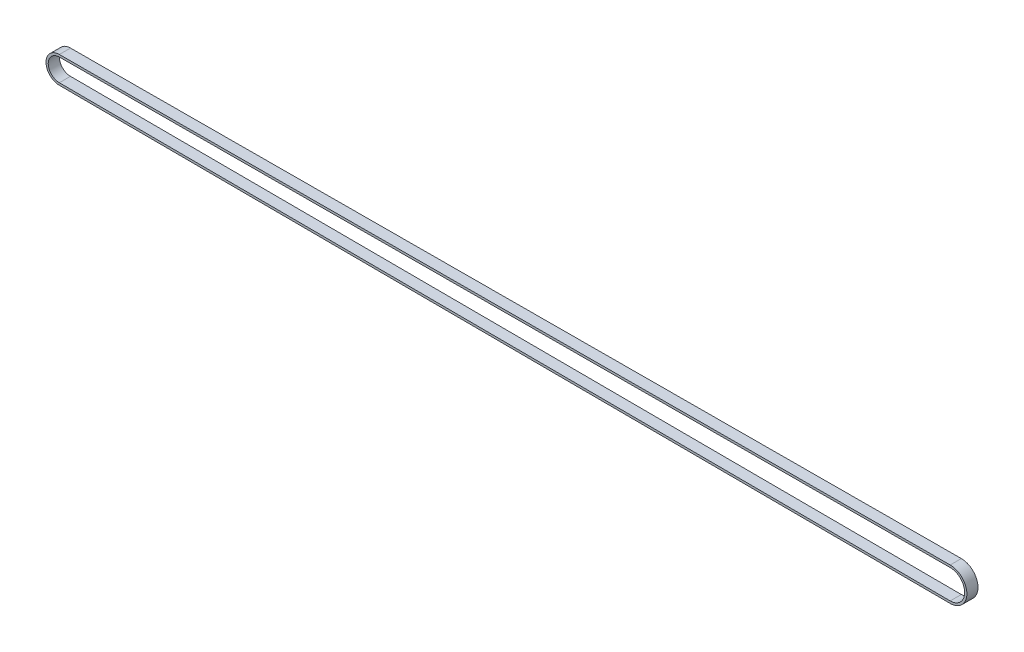
ISO-10303-21;
HEADER;
FILE_DESCRIPTION(('STEP AP214'),'2;1');
FILE_NAME('part.step','',(''),(''),'','','');
FILE_SCHEMA(('AUTOMOTIVE_DESIGN { 1 0 10303 214 1 1 1 1 }'));
ENDSEC;
DATA;
#1=APPLICATION_CONTEXT('core data for automotive mechanical design processes');
#2=APPLICATION_PROTOCOL_DEFINITION('international standard','automotive_design',2000,#1);
#3=PRODUCT_CONTEXT('',#1,'mechanical');
#4=PRODUCT('Part','Part','',(#3));
#5=PRODUCT_RELATED_PRODUCT_CATEGORY('part','',(#4));
#6=PRODUCT_DEFINITION_FORMATION('','',#4);
#7=PRODUCT_DEFINITION_CONTEXT('part definition',#1,'design');
#8=PRODUCT_DEFINITION('design','',#6,#7);
#9=PRODUCT_DEFINITION_SHAPE('','',#8);
#10=(LENGTH_UNIT() NAMED_UNIT(*) SI_UNIT(.MILLI.,.METRE.));
#11=(NAMED_UNIT(*) PLANE_ANGLE_UNIT() SI_UNIT($,.RADIAN.));
#12=(NAMED_UNIT(*) SI_UNIT($,.STERADIAN.) SOLID_ANGLE_UNIT());
#13=UNCERTAINTY_MEASURE_WITH_UNIT(LENGTH_MEASURE(1.E-05),#10,'distance_accuracy_value','');
#14=(GEOMETRIC_REPRESENTATION_CONTEXT(3) GLOBAL_UNCERTAINTY_ASSIGNED_CONTEXT((#13)) GLOBAL_UNIT_ASSIGNED_CONTEXT((#10,
#11,#12)) REPRESENTATION_CONTEXT('',''));
#15=CARTESIAN_POINT('',(0.,0.,0.));
#16=DIRECTION('',(0.,0.,1.));
#17=DIRECTION('',(1.,0.,0.));
#18=AXIS2_PLACEMENT_3D('',#15,#16,#17);
#19=CARTESIAN_POINT('',(0.,0.,5.));
#20=DIRECTION('',(0.,0.,1.));
#21=DIRECTION('',(1.,0.,0.));
#22=AXIS2_PLACEMENT_3D('',#19,#20,#21);
#23=PLANE('',#22);
#24=CARTESIAN_POINT('',(0.,0.,5.));
#25=DIRECTION('',(0.,0.,1.));
#26=DIRECTION('',(1.,0.,0.));
#27=AXIS2_PLACEMENT_3D('',#24,#25,#26);
#28=CIRCLE('',#27,7.5);
#29=CARTESIAN_POINT('',(0.,-7.5,5.));
#30=VERTEX_POINT('',#29);
#31=CARTESIAN_POINT('',(0.,7.5,5.));
#32=VERTEX_POINT('',#31);
#33=EDGE_CURVE('E134',#30,#32,#28,.T.);
#34=ORIENTED_EDGE('',*,*,#33,.T.);
#35=DIRECTION('',(-0.999992986369008,-0.00374529208377893,0.));
#36=VECTOR('',#35,1.);
#37=CARTESIAN_POINT('',(-400.5,6.00000000000005,5.));
#38=LINE('',#37,#36);
#39=CARTESIAN_POINT('',(-400.5,6.00000000000005,5.));
#40=VERTEX_POINT('',#39);
#41=EDGE_CURVE('E137',#32,#40,#38,.T.);
#42=ORIENTED_EDGE('',*,*,#41,.T.);
#43=CARTESIAN_POINT('',(-400.5,0.,5.));
#44=DIRECTION('',(0.,0.,1.));
#45=DIRECTION('',(1.,0.,0.));
#46=AXIS2_PLACEMENT_3D('',#43,#44,#45);
#47=CIRCLE('',#46,6.00000000000005);
#48=CARTESIAN_POINT('',(-400.5,-6.0000000000001,5.));
#49=VERTEX_POINT('',#48);
#50=EDGE_CURVE('E140',#40,#49,#47,.T.);
#51=ORIENTED_EDGE('',*,*,#50,.T.);
#52=DIRECTION('',(0.999992986369008,-0.00374529208377893,0.));
#53=VECTOR('',#52,1.);
#54=CARTESIAN_POINT('',(-400.5,-6.00000000000005,5.));
#55=LINE('',#54,#53);
#56=EDGE_CURVE('E142',#49,#30,#55,.T.);
#57=ORIENTED_EDGE('',*,*,#56,.T.);
#58=EDGE_LOOP('',(#34,#42,#51,#57));
#59=FACE_BOUND('',#58,.T.);
#60=DIRECTION('',(-0.999992986369008,-0.00374529208377893,0.));
#61=VECTOR('',#60,1.);
#62=CARTESIAN_POINT('',(-400.5,5.00000000000005,5.));
#63=LINE('',#62,#61);
#64=CARTESIAN_POINT('',(0.,6.5,5.));
#65=VERTEX_POINT('',#64);
#66=CARTESIAN_POINT('',(-400.5,5.00000000000005,5.));
#67=VERTEX_POINT('',#66);
#68=EDGE_CURVE('E106',#65,#67,#63,.T.);
#69=ORIENTED_EDGE('',*,*,#68,.F.);
#70=CARTESIAN_POINT('',(0.,0.,5.));
#71=DIRECTION('',(0.,0.,1.));
#72=DIRECTION('',(1.,0.,0.));
#73=AXIS2_PLACEMENT_3D('',#70,#71,#72);
#74=CIRCLE('',#73,6.5);
#75=CARTESIAN_POINT('',(0.,-6.5,5.));
#76=VERTEX_POINT('',#75);
#77=EDGE_CURVE('E98',#76,#65,#74,.T.);
#78=ORIENTED_EDGE('',*,*,#77,.F.);
#79=DIRECTION('',(0.999992986369008,-0.00374529208377893,0.));
#80=VECTOR('',#79,1.);
#81=CARTESIAN_POINT('',(-400.5,-5.00000000000005,5.));
#82=LINE('',#81,#80);
#83=CARTESIAN_POINT('',(-400.5,-5.00000000000005,5.));
#84=VERTEX_POINT('',#83);
#85=EDGE_CURVE('E120',#84,#76,#82,.T.);
#86=ORIENTED_EDGE('',*,*,#85,.F.);
#87=CARTESIAN_POINT('',(-400.5,0.,5.));
#88=DIRECTION('',(0.,0.,1.));
#89=DIRECTION('',(1.,0.,0.));
#90=AXIS2_PLACEMENT_3D('',#87,#88,#89);
#91=CIRCLE('',#90,5.00000000000005);
#92=EDGE_CURVE('E118',#67,#84,#91,.T.);
#93=ORIENTED_EDGE('',*,*,#92,.F.);
#94=EDGE_LOOP('',(#69,#78,#86,#93));
#95=FACE_BOUND('',#94,.T.);
#96=ADVANCED_FACE('F33',(#59,#95),#23,.T.);
#97=CARTESIAN_POINT('',(0.,0.,0.));
#98=DIRECTION('',(0.,0.,1.));
#99=DIRECTION('',(1.,0.,0.));
#100=AXIS2_PLACEMENT_3D('',#97,#98,#99);
#101=PLANE('',#100);
#102=CARTESIAN_POINT('',(0.,0.,0.));
#103=DIRECTION('',(0.,0.,1.));
#104=DIRECTION('',(1.,0.,0.));
#105=AXIS2_PLACEMENT_3D('',#102,#103,#104);
#106=CIRCLE('',#105,7.5);
#107=CARTESIAN_POINT('',(0.,-7.5,0.));
#108=VERTEX_POINT('',#107);
#109=CARTESIAN_POINT('',(0.,7.5,0.));
#110=VERTEX_POINT('',#109);
#111=EDGE_CURVE('E114',#108,#110,#106,.T.);
#112=ORIENTED_EDGE('',*,*,#111,.F.);
#113=DIRECTION('',(0.999992986369008,-0.00374529208377893,0.));
#114=VECTOR('',#113,1.);
#115=CARTESIAN_POINT('',(-400.5,-6.00000000000005,0.));
#116=LINE('',#115,#114);
#117=CARTESIAN_POINT('',(-400.5,-6.0000000000001,0.));
#118=VERTEX_POINT('',#117);
#119=EDGE_CURVE('E138',#118,#108,#116,.T.);
#120=ORIENTED_EDGE('',*,*,#119,.F.);
#121=CARTESIAN_POINT('',(-400.5,0.,0.));
#122=DIRECTION('',(0.,0.,1.));
#123=DIRECTION('',(1.,0.,0.));
#124=AXIS2_PLACEMENT_3D('',#121,#122,#123);
#125=CIRCLE('',#124,6.00000000000005);
#126=CARTESIAN_POINT('',(-400.5,6.00000000000005,0.));
#127=VERTEX_POINT('',#126);
#128=EDGE_CURVE('E149',#127,#118,#125,.T.);
#129=ORIENTED_EDGE('',*,*,#128,.F.);
#130=DIRECTION('',(-0.999992986369008,-0.00374529208377893,0.));
#131=VECTOR('',#130,1.);
#132=CARTESIAN_POINT('',(-400.5,6.00000000000005,0.));
#133=LINE('',#132,#131);
#134=EDGE_CURVE('E147',#110,#127,#133,.T.);
#135=ORIENTED_EDGE('',*,*,#134,.F.);
#136=EDGE_LOOP('',(#112,#120,#129,#135));
#137=FACE_BOUND('',#136,.T.);
#138=CARTESIAN_POINT('',(0.,0.,0.));
#139=DIRECTION('',(0.,0.,1.));
#140=DIRECTION('',(1.,0.,0.));
#141=AXIS2_PLACEMENT_3D('',#138,#139,#140);
#142=CIRCLE('',#141,6.5);
#143=CARTESIAN_POINT('',(0.,-6.5,0.));
#144=VERTEX_POINT('',#143);
#145=CARTESIAN_POINT('',(0.,6.5,0.));
#146=VERTEX_POINT('',#145);
#147=EDGE_CURVE('E56',#144,#146,#142,.T.);
#148=ORIENTED_EDGE('',*,*,#147,.T.);
#149=DIRECTION('',(-0.999992986369008,-0.00374529208377893,0.));
#150=VECTOR('',#149,1.);
#151=CARTESIAN_POINT('',(-400.5,5.00000000000005,0.));
#152=LINE('',#151,#150);
#153=CARTESIAN_POINT('',(-400.5,5.00000000000005,0.));
#154=VERTEX_POINT('',#153);
#155=EDGE_CURVE('E113',#146,#154,#152,.T.);
#156=ORIENTED_EDGE('',*,*,#155,.T.);
#157=CARTESIAN_POINT('',(-400.5,0.,0.));
#158=DIRECTION('',(0.,0.,1.));
#159=DIRECTION('',(1.,0.,0.));
#160=AXIS2_PLACEMENT_3D('',#157,#158,#159);
#161=CIRCLE('',#160,5.00000000000005);
#162=CARTESIAN_POINT('',(-400.5,-5.0000000000001,0.));
#163=VERTEX_POINT('',#162);
#164=EDGE_CURVE('E126',#154,#163,#161,.T.);
#165=ORIENTED_EDGE('',*,*,#164,.T.);
#166=DIRECTION('',(0.999992986369008,-0.00374529208377893,0.));
#167=VECTOR('',#166,1.);
#168=CARTESIAN_POINT('',(-400.5,-5.00000000000005,0.));
#169=LINE('',#168,#167);
#170=EDGE_CURVE('E107',#163,#144,#169,.T.);
#171=ORIENTED_EDGE('',*,*,#170,.T.);
#172=EDGE_LOOP('',(#148,#156,#165,#171));
#173=FACE_BOUND('',#172,.T.);
#174=ADVANCED_FACE('F167',(#137,#173),#101,.F.);
#175=CARTESIAN_POINT('',(0.,0.,5.));
#176=DIRECTION('',(0.,0.,-1.));
#177=DIRECTION('',(-1.,0.,0.));
#178=AXIS2_PLACEMENT_3D('',#175,#176,#177);
#179=CYLINDRICAL_SURFACE('',#178,7.5);
#180=ORIENTED_EDGE('',*,*,#111,.T.);
#181=DIRECTION('',(0.,0.,-1.));
#182=VECTOR('',#181,1.);
#183=CARTESIAN_POINT('',(0.,7.5,5.));
#184=LINE('',#183,#182);
#185=EDGE_CURVE('E11',#32,#110,#184,.T.);
#186=ORIENTED_EDGE('',*,*,#185,.F.);
#187=ORIENTED_EDGE('',*,*,#33,.F.);
#188=DIRECTION('',(0.,0.,-1.));
#189=VECTOR('',#188,1.);
#190=CARTESIAN_POINT('',(0.,-7.5,5.));
#191=LINE('',#190,#189);
#192=EDGE_CURVE('E144',#30,#108,#191,.T.);
#193=ORIENTED_EDGE('',*,*,#192,.T.);
#194=EDGE_LOOP('',(#180,#186,#187,#193));
#195=FACE_BOUND('',#194,.T.);
#196=ADVANCED_FACE('F35',(#195),#179,.T.);
#197=CARTESIAN_POINT('',(-400.5,6.00000000000005,5.));
#198=DIRECTION('',(0.00374529208377893,-0.999992986369008,0.));
#199=DIRECTION('',(0.999992986369008,0.00374529208377893,0.));
#200=AXIS2_PLACEMENT_3D('',#197,#198,#199);
#201=PLANE('',#200);
#202=ORIENTED_EDGE('',*,*,#134,.T.);
#203=DIRECTION('',(0.,0.,-1.));
#204=VECTOR('',#203,1.);
#205=CARTESIAN_POINT('',(-400.5,6.00000000000005,5.));
#206=LINE('',#205,#204);
#207=EDGE_CURVE('E41',#40,#127,#206,.T.);
#208=ORIENTED_EDGE('',*,*,#207,.F.);
#209=ORIENTED_EDGE('',*,*,#41,.F.);
#210=ORIENTED_EDGE('',*,*,#185,.T.);
#211=EDGE_LOOP('',(#202,#208,#209,#210));
#212=FACE_BOUND('',#211,.T.);
#213=ADVANCED_FACE('F177',(#212),#201,.F.);
#214=CARTESIAN_POINT('',(-400.5,0.,5.));
#215=DIRECTION('',(0.,0.,-1.));
#216=DIRECTION('',(-1.,0.,0.));
#217=AXIS2_PLACEMENT_3D('',#214,#215,#216);
#218=CYLINDRICAL_SURFACE('',#217,6.00000000000005);
#219=ORIENTED_EDGE('',*,*,#128,.T.);
#220=DIRECTION('',(0.,0.,-1.));
#221=VECTOR('',#220,1.);
#222=CARTESIAN_POINT('',(-400.5,-6.0000000000001,5.));
#223=LINE('',#222,#221);
#224=EDGE_CURVE('E154',#49,#118,#223,.T.);
#225=ORIENTED_EDGE('',*,*,#224,.F.);
#226=ORIENTED_EDGE('',*,*,#50,.F.);
#227=ORIENTED_EDGE('',*,*,#207,.T.);
#228=EDGE_LOOP('',(#219,#225,#226,#227));
#229=FACE_BOUND('',#228,.T.);
#230=ADVANCED_FACE('F161',(#229),#218,.T.);
#231=CARTESIAN_POINT('',(-400.5,-6.00000000000005,5.));
#232=DIRECTION('',(0.00374529208377893,0.999992986369008,0.));
#233=DIRECTION('',(-0.999992986369008,0.00374529208377893,0.));
#234=AXIS2_PLACEMENT_3D('',#231,#232,#233);
#235=PLANE('',#234);
#236=ORIENTED_EDGE('',*,*,#119,.T.);
#237=ORIENTED_EDGE('',*,*,#192,.F.);
#238=ORIENTED_EDGE('',*,*,#56,.F.);
#239=ORIENTED_EDGE('',*,*,#224,.T.);
#240=EDGE_LOOP('',(#236,#237,#238,#239));
#241=FACE_BOUND('',#240,.T.);
#242=ADVANCED_FACE('F171',(#241),#235,.F.);
#243=CARTESIAN_POINT('',(0.,0.,5.));
#244=DIRECTION('',(0.,0.,-1.));
#245=DIRECTION('',(-1.,0.,0.));
#246=AXIS2_PLACEMENT_3D('',#243,#244,#245);
#247=CYLINDRICAL_SURFACE('',#246,6.5);
#248=ORIENTED_EDGE('',*,*,#147,.F.);
#249=DIRECTION('',(0.,0.,-1.));
#250=VECTOR('',#249,1.);
#251=CARTESIAN_POINT('',(0.,-6.5,5.));
#252=LINE('',#251,#250);
#253=EDGE_CURVE('E102',#76,#144,#252,.T.);
#254=ORIENTED_EDGE('',*,*,#253,.F.);
#255=ORIENTED_EDGE('',*,*,#77,.T.);
#256=DIRECTION('',(0.,0.,-1.));
#257=VECTOR('',#256,1.);
#258=CARTESIAN_POINT('',(0.,6.5,5.));
#259=LINE('',#258,#257);
#260=EDGE_CURVE('E101',#65,#146,#259,.T.);
#261=ORIENTED_EDGE('',*,*,#260,.T.);
#262=EDGE_LOOP('',(#248,#254,#255,#261));
#263=FACE_BOUND('',#262,.T.);
#264=ADVANCED_FACE('F100',(#263),#247,.F.);
#265=CARTESIAN_POINT('',(-400.5,5.00000000000005,5.));
#266=DIRECTION('',(0.00374529208377893,-0.999992986369008,0.));
#267=DIRECTION('',(0.999992986369008,0.00374529208377893,0.));
#268=AXIS2_PLACEMENT_3D('',#265,#266,#267);
#269=PLANE('',#268);
#270=ORIENTED_EDGE('',*,*,#155,.F.);
#271=ORIENTED_EDGE('',*,*,#260,.F.);
#272=ORIENTED_EDGE('',*,*,#68,.T.);
#273=DIRECTION('',(0.,0.,-1.));
#274=VECTOR('',#273,1.);
#275=CARTESIAN_POINT('',(-400.5,5.00000000000005,5.));
#276=LINE('',#275,#274);
#277=EDGE_CURVE('E115',#67,#154,#276,.T.);
#278=ORIENTED_EDGE('',*,*,#277,.T.);
#279=EDGE_LOOP('',(#270,#271,#272,#278));
#280=FACE_BOUND('',#279,.T.);
#281=ADVANCED_FACE('F110',(#280),#269,.T.);
#282=CARTESIAN_POINT('',(-400.5,0.,5.));
#283=DIRECTION('',(0.,0.,-1.));
#284=DIRECTION('',(-1.,0.,0.));
#285=AXIS2_PLACEMENT_3D('',#282,#283,#284);
#286=CYLINDRICAL_SURFACE('',#285,5.00000000000005);
#287=ORIENTED_EDGE('',*,*,#164,.F.);
#288=ORIENTED_EDGE('',*,*,#277,.F.);
#289=ORIENTED_EDGE('',*,*,#92,.T.);
#290=DIRECTION('',(0.,0.,-1.));
#291=VECTOR('',#290,1.);
#292=CARTESIAN_POINT('',(-400.5,-5.0000000000001,5.));
#293=LINE('',#292,#291);
#294=EDGE_CURVE('E48',#84,#163,#293,.T.);
#295=ORIENTED_EDGE('',*,*,#294,.T.);
#296=EDGE_LOOP('',(#287,#288,#289,#295));
#297=FACE_BOUND('',#296,.T.);
#298=ADVANCED_FACE('F200',(#297),#286,.F.);
#299=CARTESIAN_POINT('',(-400.5,-5.00000000000005,5.));
#300=DIRECTION('',(0.00374529208377893,0.999992986369008,0.));
#301=DIRECTION('',(-0.999992986369008,0.00374529208377893,0.));
#302=AXIS2_PLACEMENT_3D('',#299,#300,#301);
#303=PLANE('',#302);
#304=ORIENTED_EDGE('',*,*,#170,.F.);
#305=ORIENTED_EDGE('',*,*,#294,.F.);
#306=ORIENTED_EDGE('',*,*,#85,.T.);
#307=ORIENTED_EDGE('',*,*,#253,.T.);
#308=EDGE_LOOP('',(#304,#305,#306,#307));
#309=FACE_BOUND('',#308,.T.);
#310=ADVANCED_FACE('F204',(#309),#303,.T.);
#311=CLOSED_SHELL('',(#96,#174,#196,#213,#230,#242,#264,#281,#298,#310));
#312=MANIFOLD_SOLID_BREP('B2',#311);
#313=ADVANCED_BREP_SHAPE_REPRESENTATION('',(#18,#312),#14);
#314=SHAPE_DEFINITION_REPRESENTATION(#9,#313);
ENDSEC;
END-ISO-10303-21;
